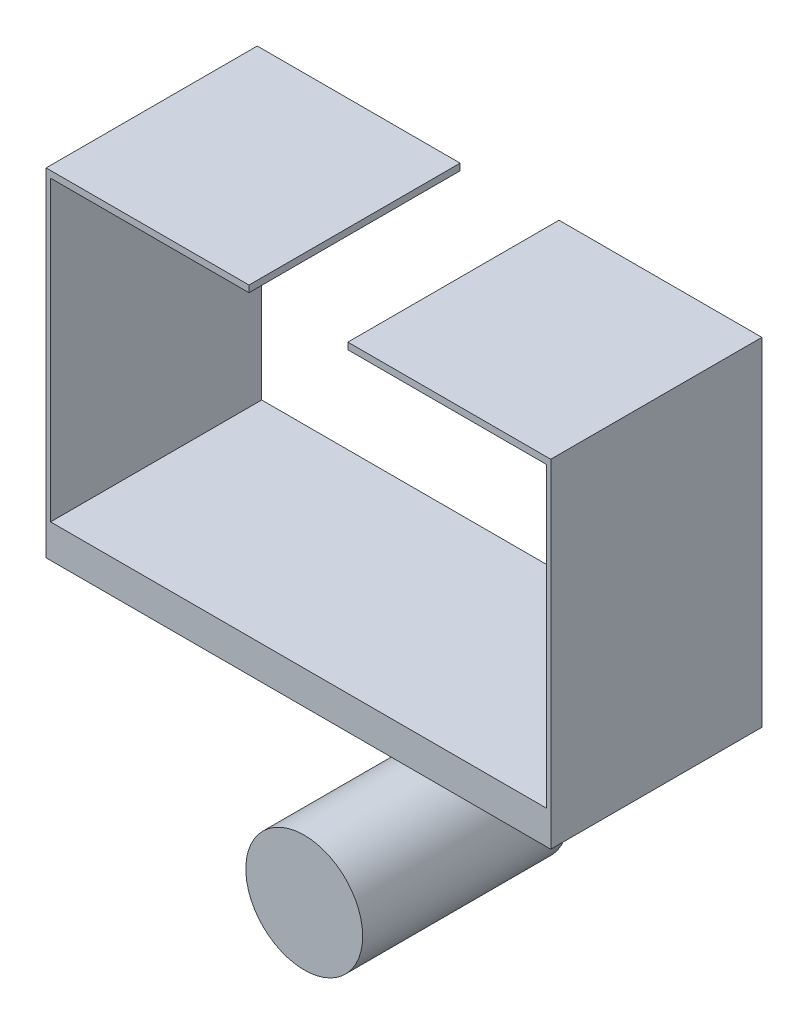
ISO-10303-21;
HEADER;
FILE_DESCRIPTION(('STEP AP214'),'2;1');
FILE_NAME('part.step','',(''),(''),'','','');
FILE_SCHEMA(('AUTOMOTIVE_DESIGN { 1 0 10303 214 1 1 1 1 }'));
ENDSEC;
DATA;
#1=APPLICATION_CONTEXT('core data for automotive mechanical design processes');
#2=APPLICATION_PROTOCOL_DEFINITION('international standard','automotive_design',2000,#1);
#3=PRODUCT_CONTEXT('',#1,'mechanical');
#4=PRODUCT('Part','Part','',(#3));
#5=PRODUCT_RELATED_PRODUCT_CATEGORY('part','',(#4));
#6=PRODUCT_DEFINITION_FORMATION('','',#4);
#7=PRODUCT_DEFINITION_CONTEXT('part definition',#1,'design');
#8=PRODUCT_DEFINITION('design','',#6,#7);
#9=PRODUCT_DEFINITION_SHAPE('','',#8);
#10=(LENGTH_UNIT() NAMED_UNIT(*) SI_UNIT(.MILLI.,.METRE.));
#11=(NAMED_UNIT(*) PLANE_ANGLE_UNIT() SI_UNIT($,.RADIAN.));
#12=(NAMED_UNIT(*) SI_UNIT($,.STERADIAN.) SOLID_ANGLE_UNIT());
#13=UNCERTAINTY_MEASURE_WITH_UNIT(LENGTH_MEASURE(1.E-05),#10,'distance_accuracy_value','');
#14=(GEOMETRIC_REPRESENTATION_CONTEXT(3) GLOBAL_UNCERTAINTY_ASSIGNED_CONTEXT((#13)) GLOBAL_UNIT_ASSIGNED_CONTEXT((#10,
#11,#12)) REPRESENTATION_CONTEXT('',''));
#15=CARTESIAN_POINT('',(0.,0.,0.));
#16=DIRECTION('',(0.,0.,1.));
#17=DIRECTION('',(1.,0.,0.));
#18=AXIS2_PLACEMENT_3D('',#15,#16,#17);
#19=CARTESIAN_POINT('',(-31.70428,64.7626659164591,-26.2633502355904));
#20=DIRECTION('',(1.,0.,0.));
#21=DIRECTION('',(0.,0.,-1.));
#22=AXIS2_PLACEMENT_3D('',#19,#20,#21);
#23=PLANE('',#22);
#24=DIRECTION('',(0.,-1.,0.));
#25=VECTOR('',#24,1.);
#26=CARTESIAN_POINT('',(-31.70428,64.7626659164591,-26.2633502355904));
#27=LINE('',#26,#25);
#28=CARTESIAN_POINT('',(-31.70428,64.7626659164591,-26.2633502355904));
#29=VERTEX_POINT('',#28);
#30=CARTESIAN_POINT('',(-31.70428,26.6880659164591,-26.2633502355904));
#31=VERTEX_POINT('',#30);
#32=EDGE_CURVE('E220',#29,#31,#27,.T.);
#33=ORIENTED_EDGE('',*,*,#32,.F.);
#34=DIRECTION('',(0.,0.,1.));
#35=VECTOR('',#34,1.);
#36=CARTESIAN_POINT('',(-31.70428,64.7626659164591,-26.2633502355904));
#37=LINE('',#36,#35);
#38=CARTESIAN_POINT('',(-31.70428,64.7626659164591,0.740860304445666));
#39=VERTEX_POINT('',#38);
#40=EDGE_CURVE('E196',#29,#39,#37,.T.);
#41=ORIENTED_EDGE('',*,*,#40,.T.);
#42=DIRECTION('',(0.,-1.,0.));
#43=VECTOR('',#42,1.);
#44=CARTESIAN_POINT('',(-31.70428,64.7626659164591,0.740860304445666));
#45=LINE('',#44,#43);
#46=CARTESIAN_POINT('',(-31.70428,26.6880659164591,0.740860304445666));
#47=VERTEX_POINT('',#46);
#48=EDGE_CURVE('E81',#39,#47,#45,.T.);
#49=ORIENTED_EDGE('',*,*,#48,.T.);
#50=DIRECTION('',(0.,0.,1.));
#51=VECTOR('',#50,1.);
#52=CARTESIAN_POINT('',(-31.70428,26.6880659164591,-26.2633502355904));
#53=LINE('',#52,#51);
#54=EDGE_CURVE('E211',#31,#47,#53,.T.);
#55=ORIENTED_EDGE('',*,*,#54,.F.);
#56=EDGE_LOOP('',(#33,#41,#49,#55));
#57=FACE_BOUND('',#56,.T.);
#58=ADVANCED_FACE('F65',(#57),#23,.T.);
#59=CARTESIAN_POINT('',(31.70428,64.7626659164591,-26.2633502355904));
#60=DIRECTION('',(1.,0.,0.));
#61=DIRECTION('',(0.,0.,-1.));
#62=AXIS2_PLACEMENT_3D('',#59,#60,#61);
#63=PLANE('',#62);
#64=DIRECTION('',(0.,0.,1.));
#65=VECTOR('',#64,1.);
#66=CARTESIAN_POINT('',(31.70428,64.7626659164591,-26.2633502355904));
#67=LINE('',#66,#65);
#68=CARTESIAN_POINT('',(31.70428,64.7626659164591,-26.2633502355904));
#69=VERTEX_POINT('',#68);
#70=CARTESIAN_POINT('',(31.70428,64.7626659164591,0.740860304445666));
#71=VERTEX_POINT('',#70);
#72=EDGE_CURVE('E228',#69,#71,#67,.T.);
#73=ORIENTED_EDGE('',*,*,#72,.F.);
#74=DIRECTION('',(0.,-1.,0.));
#75=VECTOR('',#74,1.);
#76=CARTESIAN_POINT('',(31.70428,64.7626659164591,-26.2633502355904));
#77=LINE('',#76,#75);
#78=CARTESIAN_POINT('',(31.70428,26.6880659164591,-26.2633502355904));
#79=VERTEX_POINT('',#78);
#80=EDGE_CURVE('E260',#69,#79,#77,.T.);
#81=ORIENTED_EDGE('',*,*,#80,.T.);
#82=DIRECTION('',(0.,0.,1.));
#83=VECTOR('',#82,1.);
#84=CARTESIAN_POINT('',(31.70428,26.6880659164591,-26.2633502355904));
#85=LINE('',#84,#83);
#86=CARTESIAN_POINT('',(31.70428,26.6880659164591,0.740860304445666));
#87=VERTEX_POINT('',#86);
#88=EDGE_CURVE('E251',#79,#87,#85,.T.);
#89=ORIENTED_EDGE('',*,*,#88,.T.);
#90=DIRECTION('',(0.,-1.,0.));
#91=VECTOR('',#90,1.);
#92=CARTESIAN_POINT('',(31.70428,64.7626659164591,0.740860304445666));
#93=LINE('',#92,#91);
#94=EDGE_CURVE('E256',#71,#87,#93,.T.);
#95=ORIENTED_EDGE('',*,*,#94,.F.);
#96=EDGE_LOOP('',(#73,#81,#89,#95));
#97=FACE_BOUND('',#96,.T.);
#98=ADVANCED_FACE('F347',(#97),#63,.F.);
#99=CARTESIAN_POINT('',(31.70428,26.6880659164591,0.740860304445666));
#100=DIRECTION('',(0.,-1.,0.));
#101=DIRECTION('',(0.,0.,-1.));
#102=AXIS2_PLACEMENT_3D('',#99,#100,#101);
#103=PLANE('',#102);
#104=DIRECTION('',(-1.,0.,0.));
#105=VECTOR('',#104,1.);
#106=CARTESIAN_POINT('',(31.70428,26.6880659164591,-26.2633502355904));
#107=LINE('',#106,#105);
#108=EDGE_CURVE('E271',#79,#31,#107,.T.);
#109=ORIENTED_EDGE('',*,*,#108,.T.);
#110=ORIENTED_EDGE('',*,*,#54,.T.);
#111=DIRECTION('',(-1.,0.,0.));
#112=VECTOR('',#111,1.);
#113=CARTESIAN_POINT('',(31.70428,26.6880659164591,0.740860304445666));
#114=LINE('',#113,#112);
#115=EDGE_CURVE('E275',#87,#47,#114,.T.);
#116=ORIENTED_EDGE('',*,*,#115,.F.);
#117=ORIENTED_EDGE('',*,*,#88,.F.);
#118=EDGE_LOOP('',(#109,#110,#116,#117));
#119=FACE_BOUND('',#118,.T.);
#120=ADVANCED_FACE('F346',(#119),#103,.F.);
#121=CARTESIAN_POINT('',(0.,0.,-25.4));
#122=DIRECTION('',(0.,0.,1.));
#123=DIRECTION('',(1.,0.,0.));
#124=AXIS2_PLACEMENT_3D('',#121,#122,#123);
#125=CYLINDRICAL_SURFACE('',#124,7.47274945212493);
#126=CARTESIAN_POINT('',(0.,0.,-25.4));
#127=DIRECTION('',(0.,0.,1.));
#128=DIRECTION('',(1.,0.,0.));
#129=AXIS2_PLACEMENT_3D('',#126,#127,#128);
#130=CIRCLE('',#129,7.47274945212493);
#131=CARTESIAN_POINT('',(7.47274945212493,0.,-25.4));
#132=VERTEX_POINT('',#131);
#133=CARTESIAN_POINT('',(-7.47274945212493,0.,-25.4));
#134=VERTEX_POINT('',#133);
#135=EDGE_CURVE('E12',#132,#134,#130,.T.);
#136=ORIENTED_EDGE('',*,*,#135,.T.);
#137=DIRECTION('',(0.,0.,1.));
#138=VECTOR('',#137,1.);
#139=CARTESIAN_POINT('',(-7.47274945212493,0.,-26.2633502355904));
#140=LINE('',#139,#138);
#141=CARTESIAN_POINT('',(-7.47274945212493,0.,-26.2633502355904));
#142=VERTEX_POINT('',#141);
#143=EDGE_CURVE('E282',#142,#134,#140,.T.);
#144=ORIENTED_EDGE('',*,*,#143,.F.);
#145=CARTESIAN_POINT('',(0.,0.,-26.2633502355904));
#146=DIRECTION('',(0.,0.,-1.));
#147=DIRECTION('',(-1.,0.,0.));
#148=AXIS2_PLACEMENT_3D('',#145,#146,#147);
#149=CIRCLE('',#148,7.47274945212493);
#150=CARTESIAN_POINT('',(7.47274945212493,0.,-26.2633502355904));
#151=VERTEX_POINT('',#150);
#152=EDGE_CURVE('E285',#151,#142,#149,.T.);
#153=ORIENTED_EDGE('',*,*,#152,.F.);
#154=DIRECTION('',(0.,0.,1.));
#155=VECTOR('',#154,1.);
#156=CARTESIAN_POINT('',(7.47274945212493,0.,-26.2633502355904));
#157=LINE('',#156,#155);
#158=EDGE_CURVE('E289',#132,#151,#157,.F.);
#159=ORIENTED_EDGE('',*,*,#158,.F.);
#160=EDGE_LOOP('',(#136,#144,#153,#159));
#161=FACE_BOUND('',#160,.T.);
#162=CARTESIAN_POINT('',(0.,0.,0.));
#163=DIRECTION('',(0.,0.,1.));
#164=DIRECTION('',(1.,0.,0.));
#165=AXIS2_PLACEMENT_3D('',#162,#163,#164);
#166=CIRCLE('',#165,7.47274945212493);
#167=CARTESIAN_POINT('',(7.47274945212493,0.,0.));
#168=VERTEX_POINT('',#167);
#169=EDGE_CURVE('E68',#168,#168,#166,.T.);
#170=ORIENTED_EDGE('',*,*,#169,.F.);
#171=EDGE_LOOP('',(#170));
#172=FACE_BOUND('',#171,.T.);
#173=ADVANCED_FACE('F61',(#161,#172),#125,.T.);
#174=CARTESIAN_POINT('',(0.,0.,0.));
#175=DIRECTION('',(0.,0.,1.));
#176=DIRECTION('',(1.,0.,0.));
#177=AXIS2_PLACEMENT_3D('',#174,#175,#176);
#178=PLANE('',#177);
#179=ORIENTED_EDGE('',*,*,#169,.T.);
#180=EDGE_LOOP('',(#179));
#181=FACE_BOUND('',#180,.T.);
#182=ADVANCED_FACE('F375',(#181),#178,.T.);
#183=CARTESIAN_POINT('',(0.,0.,-25.4));
#184=DIRECTION('',(0.,0.,-1.));
#185=DIRECTION('',(-1.,0.,0.));
#186=AXIS2_PLACEMENT_3D('',#183,#184,#185);
#187=PLANE('',#186);
#188=ORIENTED_EDGE('',*,*,#135,.F.);
#189=DIRECTION('',(0.,1.,0.));
#190=VECTOR('',#189,1.);
#191=CARTESIAN_POINT('',(7.47274945212493,0.,-25.4));
#192=LINE('',#191,#190);
#193=CARTESIAN_POINT('',(7.47274945212493,22.4182483563748,-25.4));
#194=VERTEX_POINT('',#193);
#195=EDGE_CURVE('E292',#132,#194,#192,.T.);
#196=ORIENTED_EDGE('',*,*,#195,.T.);
#197=DIRECTION('',(-1.,0.,0.));
#198=VECTOR('',#197,1.);
#199=CARTESIAN_POINT('',(7.47274945212493,22.4182483563748,-25.4));
#200=LINE('',#199,#198);
#201=CARTESIAN_POINT('',(-7.47274945212493,22.4182483563748,-25.4));
#202=VERTEX_POINT('',#201);
#203=EDGE_CURVE('E277',#194,#202,#200,.T.);
#204=ORIENTED_EDGE('',*,*,#203,.T.);
#205=DIRECTION('',(0.,1.,0.));
#206=VECTOR('',#205,1.);
#207=CARTESIAN_POINT('',(-7.47274945212493,0.,-25.4));
#208=LINE('',#207,#206);
#209=EDGE_CURVE('E298',#134,#202,#208,.T.);
#210=ORIENTED_EDGE('',*,*,#209,.F.);
#211=EDGE_LOOP('',(#188,#196,#204,#210));
#212=FACE_BOUND('',#211,.T.);
#213=ADVANCED_FACE('F314',(#212),#187,.F.);
#214=CARTESIAN_POINT('',(0.,0.,-26.2633502355904));
#215=DIRECTION('',(0.,0.,-1.));
#216=DIRECTION('',(-1.,0.,0.));
#217=AXIS2_PLACEMENT_3D('',#214,#215,#216);
#218=PLANE('',#217);
#219=ORIENTED_EDGE('',*,*,#152,.T.);
#220=DIRECTION('',(0.,1.,0.));
#221=VECTOR('',#220,1.);
#222=CARTESIAN_POINT('',(-7.47274945212493,0.,-26.2633502355904));
#223=LINE('',#222,#221);
#224=CARTESIAN_POINT('',(-7.47274945212493,22.4182483563748,-26.2633502355904));
#225=VERTEX_POINT('',#224);
#226=EDGE_CURVE('E290',#142,#225,#223,.T.);
#227=ORIENTED_EDGE('',*,*,#226,.T.);
#228=DIRECTION('',(-1.,0.,0.));
#229=VECTOR('',#228,1.);
#230=CARTESIAN_POINT('',(31.70428,22.4182483563747,-26.2633502355904));
#231=LINE('',#230,#229);
#232=CARTESIAN_POINT('',(-32.2731689597485,22.4182483563747,-26.2633502355904));
#233=VERTEX_POINT('',#232);
#234=EDGE_CURVE('E270',#225,#233,#231,.T.);
#235=ORIENTED_EDGE('',*,*,#234,.T.);
#236=DIRECTION('',(0.,1.,0.));
#237=VECTOR('',#236,1.);
#238=CARTESIAN_POINT('',(-32.2731689597485,26.6880659164591,-26.2633502355904));
#239=LINE('',#238,#237);
#240=CARTESIAN_POINT('',(-32.2731689597485,65.6161132249689,-26.2633502355904));
#241=VERTEX_POINT('',#240);
#242=EDGE_CURVE('E183',#233,#241,#239,.T.);
#243=ORIENTED_EDGE('',*,*,#242,.T.);
#244=DIRECTION('',(1.,0.,0.));
#245=VECTOR('',#244,1.);
#246=CARTESIAN_POINT('',(-31.70428,65.6161132249689,-26.2633502355904));
#247=LINE('',#246,#245);
#248=CARTESIAN_POINT('',(-6.3246,65.6161132249689,-26.2633502355904));
#249=VERTEX_POINT('',#248);
#250=EDGE_CURVE('E180',#241,#249,#247,.T.);
#251=ORIENTED_EDGE('',*,*,#250,.T.);
#252=DIRECTION('',(0.,-1.,0.));
#253=VECTOR('',#252,1.);
#254=CARTESIAN_POINT('',(-6.3246,65.6161132249689,-26.2633502355904));
#255=LINE('',#254,#253);
#256=CARTESIAN_POINT('',(-6.3246,64.7626659164591,-26.2633502355904));
#257=VERTEX_POINT('',#256);
#258=EDGE_CURVE('E181',#249,#257,#255,.T.);
#259=ORIENTED_EDGE('',*,*,#258,.T.);
#260=DIRECTION('',(-1.,0.,0.));
#261=VECTOR('',#260,1.);
#262=CARTESIAN_POINT('',(-6.3246,64.7626659164591,-26.2633502355904));
#263=LINE('',#262,#261);
#264=EDGE_CURVE('E206',#257,#29,#263,.T.);
#265=ORIENTED_EDGE('',*,*,#264,.T.);
#266=ORIENTED_EDGE('',*,*,#32,.T.);
#267=ORIENTED_EDGE('',*,*,#108,.F.);
#268=ORIENTED_EDGE('',*,*,#80,.F.);
#269=DIRECTION('',(1.,0.,0.));
#270=VECTOR('',#269,1.);
#271=CARTESIAN_POINT('',(6.3246,64.7626659164591,-26.2633502355904));
#272=LINE('',#271,#270);
#273=CARTESIAN_POINT('',(6.3246,64.7626659164591,-26.2633502355904));
#274=VERTEX_POINT('',#273);
#275=EDGE_CURVE('E243',#274,#69,#272,.T.);
#276=ORIENTED_EDGE('',*,*,#275,.F.);
#277=DIRECTION('',(0.,-1.,0.));
#278=VECTOR('',#277,1.);
#279=CARTESIAN_POINT('',(6.3246,65.6161132249689,-26.2633502355904));
#280=LINE('',#279,#278);
#281=CARTESIAN_POINT('',(6.3246,65.6161132249689,-26.2633502355904));
#282=VERTEX_POINT('',#281);
#283=EDGE_CURVE('E227',#282,#274,#280,.T.);
#284=ORIENTED_EDGE('',*,*,#283,.F.);
#285=DIRECTION('',(-1.,0.,0.));
#286=VECTOR('',#285,1.);
#287=CARTESIAN_POINT('',(31.70428,65.6161132249689,-26.2633502355904));
#288=LINE('',#287,#286);
#289=CARTESIAN_POINT('',(32.2731689597485,65.6161132249689,-26.2633502355904));
#290=VERTEX_POINT('',#289);
#291=EDGE_CURVE('E255',#290,#282,#288,.T.);
#292=ORIENTED_EDGE('',*,*,#291,.F.);
#293=DIRECTION('',(0.,1.,0.));
#294=VECTOR('',#293,1.);
#295=CARTESIAN_POINT('',(32.2731689597485,26.6880659164591,-26.2633502355904));
#296=LINE('',#295,#294);
#297=CARTESIAN_POINT('',(32.2731689597485,22.4182483563747,-26.2633502355904));
#298=VERTEX_POINT('',#297);
#299=EDGE_CURVE('E269',#298,#290,#296,.T.);
#300=ORIENTED_EDGE('',*,*,#299,.F.);
#301=CARTESIAN_POINT('',(7.47274945212493,22.4182483563748,-26.2633502355904));
#302=VERTEX_POINT('',#301);
#303=EDGE_CURVE('E280',#298,#302,#231,.T.);
#304=ORIENTED_EDGE('',*,*,#303,.T.);
#305=DIRECTION('',(0.,1.,0.));
#306=VECTOR('',#305,1.);
#307=CARTESIAN_POINT('',(7.47274945212493,0.,-26.2633502355904));
#308=LINE('',#307,#306);
#309=EDGE_CURVE('E293',#151,#302,#308,.T.);
#310=ORIENTED_EDGE('',*,*,#309,.F.);
#311=EDGE_LOOP('',(#219,#227,#235,#243,#251,#259,#265,#266,#267,#268,#276,#284,#292,#300,#304,#310));
#312=FACE_BOUND('',#311,.T.);
#313=ADVANCED_FACE('F179',(#312),#218,.T.);
#314=CARTESIAN_POINT('',(7.47274945212493,0.,-26.2633502355904));
#315=DIRECTION('',(1.,0.,0.));
#316=DIRECTION('',(0.,1.,0.));
#317=AXIS2_PLACEMENT_3D('',#314,#315,#316);
#318=PLANE('',#317);
#319=ORIENTED_EDGE('',*,*,#195,.F.);
#320=ORIENTED_EDGE('',*,*,#158,.T.);
#321=ORIENTED_EDGE('',*,*,#309,.T.);
#322=DIRECTION('',(0.,0.,1.));
#323=VECTOR('',#322,1.);
#324=CARTESIAN_POINT('',(7.47274945212493,22.4182483563748,-26.2633502355904));
#325=LINE('',#324,#323);
#326=EDGE_CURVE('E284',#302,#194,#325,.T.);
#327=ORIENTED_EDGE('',*,*,#326,.T.);
#328=EDGE_LOOP('',(#319,#320,#321,#327));
#329=FACE_BOUND('',#328,.T.);
#330=ADVANCED_FACE('F325',(#329),#318,.T.);
#331=CARTESIAN_POINT('',(-7.47274945212493,0.,-26.2633502355904));
#332=DIRECTION('',(1.,0.,0.));
#333=DIRECTION('',(0.,0.,-1.));
#334=AXIS2_PLACEMENT_3D('',#331,#332,#333);
#335=PLANE('',#334);
#336=ORIENTED_EDGE('',*,*,#209,.T.);
#337=DIRECTION('',(0.,0.,1.));
#338=VECTOR('',#337,1.);
#339=CARTESIAN_POINT('',(-7.47274945212493,22.4182483563748,-26.2633502355904));
#340=LINE('',#339,#338);
#341=EDGE_CURVE('E295',#225,#202,#340,.T.);
#342=ORIENTED_EDGE('',*,*,#341,.F.);
#343=ORIENTED_EDGE('',*,*,#226,.F.);
#344=ORIENTED_EDGE('',*,*,#143,.T.);
#345=EDGE_LOOP('',(#336,#342,#343,#344));
#346=FACE_BOUND('',#345,.T.);
#347=ADVANCED_FACE('F311',(#346),#335,.F.);
#348=CARTESIAN_POINT('',(31.70428,22.4182483563747,0.740860304445666));
#349=DIRECTION('',(0.,-1.,0.));
#350=DIRECTION('',(1.,0.,0.));
#351=AXIS2_PLACEMENT_3D('',#348,#349,#350);
#352=PLANE('',#351);
#353=ORIENTED_EDGE('',*,*,#326,.F.);
#354=ORIENTED_EDGE('',*,*,#303,.F.);
#355=DIRECTION('',(0.,0.,-1.));
#356=VECTOR('',#355,1.);
#357=CARTESIAN_POINT('',(32.2731689597485,22.4182483563747,0.740860304445666));
#358=LINE('',#357,#356);
#359=CARTESIAN_POINT('',(32.2731689597485,22.4182483563747,0.740860304445666));
#360=VERTEX_POINT('',#359);
#361=EDGE_CURVE('E262',#360,#298,#358,.T.);
#362=ORIENTED_EDGE('',*,*,#361,.F.);
#363=DIRECTION('',(-1.,0.,0.));
#364=VECTOR('',#363,1.);
#365=CARTESIAN_POINT('',(31.70428,22.4182483563747,0.740860304445666));
#366=LINE('',#365,#364);
#367=CARTESIAN_POINT('',(-32.2731689597485,22.4182483563747,0.740860304445666));
#368=VERTEX_POINT('',#367);
#369=EDGE_CURVE('E266',#360,#368,#366,.T.);
#370=ORIENTED_EDGE('',*,*,#369,.T.);
#371=DIRECTION('',(0.,0.,-1.));
#372=VECTOR('',#371,1.);
#373=CARTESIAN_POINT('',(-32.2731689597485,22.4182483563747,0.740860304445666));
#374=LINE('',#373,#372);
#375=EDGE_CURVE('E222',#368,#233,#374,.T.);
#376=ORIENTED_EDGE('',*,*,#375,.T.);
#377=ORIENTED_EDGE('',*,*,#234,.F.);
#378=ORIENTED_EDGE('',*,*,#341,.T.);
#379=ORIENTED_EDGE('',*,*,#203,.F.);
#380=EDGE_LOOP('',(#353,#354,#362,#370,#376,#377,#378,#379));
#381=FACE_BOUND('',#380,.T.);
#382=ADVANCED_FACE('F308',(#381),#352,.T.);
#383=CARTESIAN_POINT('',(0.,0.,0.740860304445666));
#384=DIRECTION('',(0.,0.,-1.));
#385=DIRECTION('',(-1.,0.,0.));
#386=AXIS2_PLACEMENT_3D('',#383,#384,#385);
#387=PLANE('',#386);
#388=ORIENTED_EDGE('',*,*,#369,.F.);
#389=DIRECTION('',(0.,-1.,0.));
#390=VECTOR('',#389,1.);
#391=CARTESIAN_POINT('',(32.2731689597485,26.6880659164591,0.740860304445666));
#392=LINE('',#391,#390);
#393=CARTESIAN_POINT('',(32.2731689597485,65.6161132249689,0.740860304445666));
#394=VERTEX_POINT('',#393);
#395=EDGE_CURVE('E263',#394,#360,#392,.T.);
#396=ORIENTED_EDGE('',*,*,#395,.F.);
#397=DIRECTION('',(1.,0.,0.));
#398=VECTOR('',#397,1.);
#399=CARTESIAN_POINT('',(31.70428,65.6161132249689,0.740860304445666));
#400=LINE('',#399,#398);
#401=CARTESIAN_POINT('',(6.3246,65.6161132249689,0.740860304445666));
#402=VERTEX_POINT('',#401);
#403=EDGE_CURVE('E246',#402,#394,#400,.T.);
#404=ORIENTED_EDGE('',*,*,#403,.F.);
#405=DIRECTION('',(0.,1.,0.));
#406=VECTOR('',#405,1.);
#407=CARTESIAN_POINT('',(6.3246,65.6161132249689,0.740860304445666));
#408=LINE('',#407,#406);
#409=CARTESIAN_POINT('',(6.3246,64.7626659164591,0.740860304445666));
#410=VERTEX_POINT('',#409);
#411=EDGE_CURVE('E235',#410,#402,#408,.T.);
#412=ORIENTED_EDGE('',*,*,#411,.F.);
#413=DIRECTION('',(1.,0.,0.));
#414=VECTOR('',#413,1.);
#415=CARTESIAN_POINT('',(6.3246,64.7626659164591,0.740860304445666));
#416=LINE('',#415,#414);
#417=EDGE_CURVE('E238',#410,#71,#416,.T.);
#418=ORIENTED_EDGE('',*,*,#417,.T.);
#419=ORIENTED_EDGE('',*,*,#94,.T.);
#420=ORIENTED_EDGE('',*,*,#115,.T.);
#421=ORIENTED_EDGE('',*,*,#48,.F.);
#422=DIRECTION('',(-1.,0.,0.));
#423=VECTOR('',#422,1.);
#424=CARTESIAN_POINT('',(-6.3246,64.7626659164591,0.740860304445666));
#425=LINE('',#424,#423);
#426=CARTESIAN_POINT('',(-6.3246,64.7626659164591,0.740860304445666));
#427=VERTEX_POINT('',#426);
#428=EDGE_CURVE('E80',#427,#39,#425,.T.);
#429=ORIENTED_EDGE('',*,*,#428,.F.);
#430=DIRECTION('',(0.,1.,0.));
#431=VECTOR('',#430,1.);
#432=CARTESIAN_POINT('',(-6.3246,65.6161132249689,0.740860304445666));
#433=LINE('',#432,#431);
#434=CARTESIAN_POINT('',(-6.3246,65.6161132249689,0.740860304445666));
#435=VERTEX_POINT('',#434);
#436=EDGE_CURVE('E202',#427,#435,#433,.T.);
#437=ORIENTED_EDGE('',*,*,#436,.T.);
#438=DIRECTION('',(-1.,0.,0.));
#439=VECTOR('',#438,1.);
#440=CARTESIAN_POINT('',(-31.70428,65.6161132249689,0.740860304445666));
#441=LINE('',#440,#439);
#442=CARTESIAN_POINT('',(-32.2731689597485,65.6161132249689,0.740860304445666));
#443=VERTEX_POINT('',#442);
#444=EDGE_CURVE('E204',#435,#443,#441,.T.);
#445=ORIENTED_EDGE('',*,*,#444,.T.);
#446=DIRECTION('',(0.,-1.,0.));
#447=VECTOR('',#446,1.);
#448=CARTESIAN_POINT('',(-32.2731689597485,26.6880659164591,0.740860304445666));
#449=LINE('',#448,#447);
#450=EDGE_CURVE('E217',#443,#368,#449,.T.);
#451=ORIENTED_EDGE('',*,*,#450,.T.);
#452=EDGE_LOOP('',(#388,#396,#404,#412,#418,#419,#420,#421,#429,#437,#445,#451));
#453=FACE_BOUND('',#452,.T.);
#454=ADVANCED_FACE('F329',(#453),#387,.F.);
#455=CARTESIAN_POINT('',(32.2731689597485,0.,0.));
#456=DIRECTION('',(1.,0.,0.));
#457=DIRECTION('',(0.,0.,-1.));
#458=AXIS2_PLACEMENT_3D('',#455,#456,#457);
#459=PLANE('',#458);
#460=ORIENTED_EDGE('',*,*,#395,.T.);
#461=ORIENTED_EDGE('',*,*,#361,.T.);
#462=ORIENTED_EDGE('',*,*,#299,.T.);
#463=DIRECTION('',(0.,0.,-1.));
#464=VECTOR('',#463,1.);
#465=CARTESIAN_POINT('',(32.2731689597485,65.6161132249689,-26.2633502355904));
#466=LINE('',#465,#464);
#467=EDGE_CURVE('E248',#394,#290,#466,.T.);
#468=ORIENTED_EDGE('',*,*,#467,.F.);
#469=EDGE_LOOP('',(#460,#461,#462,#468));
#470=FACE_BOUND('',#469,.T.);
#471=ADVANCED_FACE('F330',(#470),#459,.T.);
#472=CARTESIAN_POINT('',(0.,65.6161132249689,0.));
#473=DIRECTION('',(0.,1.,0.));
#474=DIRECTION('',(0.,0.,1.));
#475=AXIS2_PLACEMENT_3D('',#472,#473,#474);
#476=PLANE('',#475);
#477=ORIENTED_EDGE('',*,*,#291,.T.);
#478=DIRECTION('',(0.,0.,-1.));
#479=VECTOR('',#478,1.);
#480=CARTESIAN_POINT('',(6.3246,65.6161132249689,-26.2633502355904));
#481=LINE('',#480,#479);
#482=EDGE_CURVE('E232',#402,#282,#481,.T.);
#483=ORIENTED_EDGE('',*,*,#482,.F.);
#484=ORIENTED_EDGE('',*,*,#403,.T.);
#485=ORIENTED_EDGE('',*,*,#467,.T.);
#486=EDGE_LOOP('',(#477,#483,#484,#485));
#487=FACE_BOUND('',#486,.T.);
#488=ADVANCED_FACE('F335',(#487),#476,.T.);
#489=CARTESIAN_POINT('',(6.3246,64.7626659164591,-26.2633502355904));
#490=DIRECTION('',(0.,1.,0.));
#491=DIRECTION('',(0.,0.,1.));
#492=AXIS2_PLACEMENT_3D('',#489,#490,#491);
#493=PLANE('',#492);
#494=ORIENTED_EDGE('',*,*,#72,.T.);
#495=ORIENTED_EDGE('',*,*,#417,.F.);
#496=DIRECTION('',(0.,0.,1.));
#497=VECTOR('',#496,1.);
#498=CARTESIAN_POINT('',(6.3246,64.7626659164591,-26.2633502355904));
#499=LINE('',#498,#497);
#500=EDGE_CURVE('E229',#274,#410,#499,.T.);
#501=ORIENTED_EDGE('',*,*,#500,.F.);
#502=ORIENTED_EDGE('',*,*,#275,.T.);
#503=EDGE_LOOP('',(#494,#495,#501,#502));
#504=FACE_BOUND('',#503,.T.);
#505=ADVANCED_FACE('F345',(#504),#493,.F.);
#506=CARTESIAN_POINT('',(6.3246,0.,0.));
#507=DIRECTION('',(-1.,0.,0.));
#508=DIRECTION('',(0.,0.,1.));
#509=AXIS2_PLACEMENT_3D('',#506,#507,#508);
#510=PLANE('',#509);
#511=ORIENTED_EDGE('',*,*,#283,.T.);
#512=ORIENTED_EDGE('',*,*,#500,.T.);
#513=ORIENTED_EDGE('',*,*,#411,.T.);
#514=ORIENTED_EDGE('',*,*,#482,.T.);
#515=EDGE_LOOP('',(#511,#512,#513,#514));
#516=FACE_BOUND('',#515,.T.);
#517=ADVANCED_FACE('F340',(#516),#510,.T.);
#518=CARTESIAN_POINT('',(-32.2731689597485,0.,0.));
#519=DIRECTION('',(-1.,0.,0.));
#520=DIRECTION('',(0.,0.,-1.));
#521=AXIS2_PLACEMENT_3D('',#518,#519,#520);
#522=PLANE('',#521);
#523=ORIENTED_EDGE('',*,*,#450,.F.);
#524=DIRECTION('',(0.,0.,-1.));
#525=VECTOR('',#524,1.);
#526=CARTESIAN_POINT('',(-32.2731689597485,65.6161132249689,-26.2633502355904));
#527=LINE('',#526,#525);
#528=EDGE_CURVE('E186',#443,#241,#527,.T.);
#529=ORIENTED_EDGE('',*,*,#528,.T.);
#530=ORIENTED_EDGE('',*,*,#242,.F.);
#531=ORIENTED_EDGE('',*,*,#375,.F.);
#532=EDGE_LOOP('',(#523,#529,#530,#531));
#533=FACE_BOUND('',#532,.T.);
#534=ADVANCED_FACE('F461',(#533),#522,.T.);
#535=CARTESIAN_POINT('',(0.,65.6161132249689,0.));
#536=DIRECTION('',(0.,1.,0.));
#537=DIRECTION('',(0.,0.,1.));
#538=AXIS2_PLACEMENT_3D('',#535,#536,#537);
#539=PLANE('',#538);
#540=ORIENTED_EDGE('',*,*,#444,.F.);
#541=DIRECTION('',(0.,0.,-1.));
#542=VECTOR('',#541,1.);
#543=CARTESIAN_POINT('',(-6.3246,65.6161132249689,-26.2633502355904));
#544=LINE('',#543,#542);
#545=EDGE_CURVE('E193',#435,#249,#544,.T.);
#546=ORIENTED_EDGE('',*,*,#545,.T.);
#547=ORIENTED_EDGE('',*,*,#250,.F.);
#548=ORIENTED_EDGE('',*,*,#528,.F.);
#549=EDGE_LOOP('',(#540,#546,#547,#548));
#550=FACE_BOUND('',#549,.T.);
#551=ADVANCED_FACE('F199',(#550),#539,.T.);
#552=CARTESIAN_POINT('',(-6.3246,64.7626659164591,-26.2633502355904));
#553=DIRECTION('',(0.,-1.,0.));
#554=DIRECTION('',(0.,0.,-1.));
#555=AXIS2_PLACEMENT_3D('',#552,#553,#554);
#556=PLANE('',#555);
#557=ORIENTED_EDGE('',*,*,#40,.F.);
#558=ORIENTED_EDGE('',*,*,#264,.F.);
#559=DIRECTION('',(0.,0.,1.));
#560=VECTOR('',#559,1.);
#561=CARTESIAN_POINT('',(-6.3246,64.7626659164591,-26.2633502355904));
#562=LINE('',#561,#560);
#563=EDGE_CURVE('E200',#257,#427,#562,.T.);
#564=ORIENTED_EDGE('',*,*,#563,.T.);
#565=ORIENTED_EDGE('',*,*,#428,.T.);
#566=EDGE_LOOP('',(#557,#558,#564,#565));
#567=FACE_BOUND('',#566,.T.);
#568=ADVANCED_FACE('F501',(#567),#556,.T.);
#569=CARTESIAN_POINT('',(-6.3246,0.,0.));
#570=DIRECTION('',(1.,0.,0.));
#571=DIRECTION('',(0.,0.,1.));
#572=AXIS2_PLACEMENT_3D('',#569,#570,#571);
#573=PLANE('',#572);
#574=ORIENTED_EDGE('',*,*,#258,.F.);
#575=ORIENTED_EDGE('',*,*,#545,.F.);
#576=ORIENTED_EDGE('',*,*,#436,.F.);
#577=ORIENTED_EDGE('',*,*,#563,.F.);
#578=EDGE_LOOP('',(#574,#575,#576,#577));
#579=FACE_BOUND('',#578,.T.);
#580=ADVANCED_FACE('F194',(#579),#573,.T.);
#581=CLOSED_SHELL('',(#58,#98,#120,#173,#182,#213,#313,#330,#347,#382,#454,#471,#488,#505,#517,
#534,#551,#568,#580));
#582=MANIFOLD_SOLID_BREP('B2',#581);
#583=ADVANCED_BREP_SHAPE_REPRESENTATION('',(#18,#582),#14);
#584=SHAPE_DEFINITION_REPRESENTATION(#9,#583);
ENDSEC;
END-ISO-10303-21;
